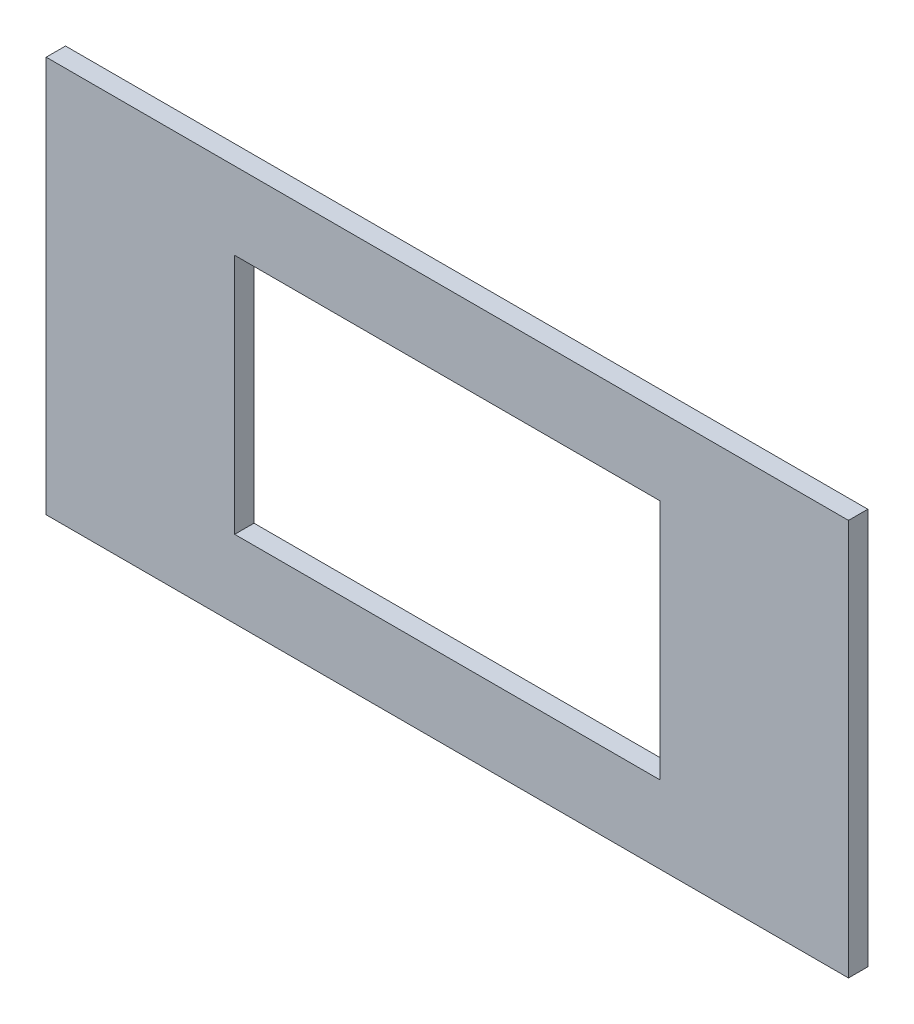
ISO-10303-21;
HEADER;
FILE_DESCRIPTION(('STEP AP214'),'2;1');
FILE_NAME('part.step','',(''),(''),'','','');
FILE_SCHEMA(('AUTOMOTIVE_DESIGN { 1 0 10303 214 1 1 1 1 }'));
ENDSEC;
DATA;
#1=APPLICATION_CONTEXT('core data for automotive mechanical design processes');
#2=APPLICATION_PROTOCOL_DEFINITION('international standard','automotive_design',2000,#1);
#3=PRODUCT_CONTEXT('',#1,'mechanical');
#4=PRODUCT('Part','Part','',(#3));
#5=PRODUCT_RELATED_PRODUCT_CATEGORY('part','',(#4));
#6=PRODUCT_DEFINITION_FORMATION('','',#4);
#7=PRODUCT_DEFINITION_CONTEXT('part definition',#1,'design');
#8=PRODUCT_DEFINITION('design','',#6,#7);
#9=PRODUCT_DEFINITION_SHAPE('','',#8);
#10=(LENGTH_UNIT() NAMED_UNIT(*) SI_UNIT(.MILLI.,.METRE.));
#11=(NAMED_UNIT(*) PLANE_ANGLE_UNIT() SI_UNIT($,.RADIAN.));
#12=(NAMED_UNIT(*) SI_UNIT($,.STERADIAN.) SOLID_ANGLE_UNIT());
#13=UNCERTAINTY_MEASURE_WITH_UNIT(LENGTH_MEASURE(1.E-05),#10,'distance_accuracy_value','');
#14=(GEOMETRIC_REPRESENTATION_CONTEXT(3) GLOBAL_UNCERTAINTY_ASSIGNED_CONTEXT((#13)) GLOBAL_UNIT_ASSIGNED_CONTEXT((#10,
#11,#12)) REPRESENTATION_CONTEXT('',''));
#15=CARTESIAN_POINT('',(0.,0.,0.));
#16=DIRECTION('',(0.,0.,1.));
#17=DIRECTION('',(1.,0.,0.));
#18=AXIS2_PLACEMENT_3D('',#15,#16,#17);
#19=CARTESIAN_POINT('',(0.,0.,0.));
#20=DIRECTION('',(0.,0.,1.));
#21=DIRECTION('',(1.,0.,0.));
#22=AXIS2_PLACEMENT_3D('',#19,#20,#21);
#23=PLANE('',#22);
#24=DIRECTION('',(1.,0.,0.));
#25=VECTOR('',#24,1.);
#26=CARTESIAN_POINT('',(-2.2,1.25,0.));
#27=LINE('',#26,#25);
#28=CARTESIAN_POINT('',(2.2,1.25,0.));
#29=VERTEX_POINT('',#28);
#30=CARTESIAN_POINT('',(-2.2,1.25,0.));
#31=VERTEX_POINT('',#30);
#32=EDGE_CURVE('E123',#29,#31,#27,.F.);
#33=ORIENTED_EDGE('',*,*,#32,.T.);
#34=DIRECTION('',(0.,1.,0.));
#35=VECTOR('',#34,1.);
#36=CARTESIAN_POINT('',(-2.2,-1.25,0.));
#37=LINE('',#36,#35);
#38=CARTESIAN_POINT('',(-2.2,-1.25,0.));
#39=VERTEX_POINT('',#38);
#40=EDGE_CURVE('E116',#31,#39,#37,.F.);
#41=ORIENTED_EDGE('',*,*,#40,.T.);
#42=DIRECTION('',(1.,0.,0.));
#43=VECTOR('',#42,1.);
#44=CARTESIAN_POINT('',(2.2,-1.25,0.));
#45=LINE('',#44,#43);
#46=CARTESIAN_POINT('',(2.2,-1.25,0.));
#47=VERTEX_POINT('',#46);
#48=EDGE_CURVE('E112',#39,#47,#45,.T.);
#49=ORIENTED_EDGE('',*,*,#48,.T.);
#50=DIRECTION('',(0.,1.,0.));
#51=VECTOR('',#50,1.);
#52=CARTESIAN_POINT('',(2.2,1.25,0.));
#53=LINE('',#52,#51);
#54=EDGE_CURVE('E110',#47,#29,#53,.T.);
#55=ORIENTED_EDGE('',*,*,#54,.T.);
#56=EDGE_LOOP('',(#33,#41,#49,#55));
#57=FACE_BOUND('',#56,.T.);
#58=DIRECTION('',(0.,1.,0.));
#59=VECTOR('',#58,1.);
#60=CARTESIAN_POINT('',(4.15,2.05,0.));
#61=LINE('',#60,#59);
#62=CARTESIAN_POINT('',(4.15,-2.05,0.));
#63=VERTEX_POINT('',#62);
#64=CARTESIAN_POINT('',(4.15,2.05,0.));
#65=VERTEX_POINT('',#64);
#66=EDGE_CURVE('E20',#63,#65,#61,.T.);
#67=ORIENTED_EDGE('',*,*,#66,.F.);
#68=DIRECTION('',(1.,0.,0.));
#69=VECTOR('',#68,1.);
#70=CARTESIAN_POINT('',(4.15,-2.05,0.));
#71=LINE('',#70,#69);
#72=CARTESIAN_POINT('',(-4.15,-2.05,0.));
#73=VERTEX_POINT('',#72);
#74=EDGE_CURVE('E107',#73,#63,#71,.T.);
#75=ORIENTED_EDGE('',*,*,#74,.F.);
#76=DIRECTION('',(0.,1.,0.));
#77=VECTOR('',#76,1.);
#78=CARTESIAN_POINT('',(-4.15,-2.05,0.));
#79=LINE('',#78,#77);
#80=CARTESIAN_POINT('',(-4.15,2.05,0.));
#81=VERTEX_POINT('',#80);
#82=EDGE_CURVE('E93',#81,#73,#79,.F.);
#83=ORIENTED_EDGE('',*,*,#82,.F.);
#84=DIRECTION('',(1.,0.,0.));
#85=VECTOR('',#84,1.);
#86=CARTESIAN_POINT('',(-4.15,2.05,0.));
#87=LINE('',#86,#85);
#88=EDGE_CURVE('E80',#65,#81,#87,.F.);
#89=ORIENTED_EDGE('',*,*,#88,.F.);
#90=EDGE_LOOP('',(#67,#75,#83,#89));
#91=FACE_BOUND('',#90,.T.);
#92=ADVANCED_FACE('F17',(#57,#91),#23,.F.);
#93=CARTESIAN_POINT('',(4.15,2.05,0.));
#94=DIRECTION('',(1.,0.,0.));
#95=DIRECTION('',(0.,0.,-1.));
#96=AXIS2_PLACEMENT_3D('',#93,#94,#95);
#97=PLANE('',#96);
#98=ORIENTED_EDGE('',*,*,#66,.T.);
#99=DIRECTION('',(0.,0.,1.));
#100=VECTOR('',#99,1.);
#101=CARTESIAN_POINT('',(4.15,2.05,0.));
#102=LINE('',#101,#100);
#103=CARTESIAN_POINT('',(4.15,2.05,0.2));
#104=VERTEX_POINT('',#103);
#105=EDGE_CURVE('E86',#104,#65,#102,.F.);
#106=ORIENTED_EDGE('',*,*,#105,.F.);
#107=DIRECTION('',(0.,1.,0.));
#108=VECTOR('',#107,1.);
#109=CARTESIAN_POINT('',(4.15,0.,0.2));
#110=LINE('',#109,#108);
#111=CARTESIAN_POINT('',(4.15,-2.05,0.2));
#112=VERTEX_POINT('',#111);
#113=EDGE_CURVE('E126',#112,#104,#110,.T.);
#114=ORIENTED_EDGE('',*,*,#113,.F.);
#115=DIRECTION('',(0.,0.,-1.));
#116=VECTOR('',#115,1.);
#117=CARTESIAN_POINT('',(4.15,-2.05,0.));
#118=LINE('',#117,#116);
#119=EDGE_CURVE('E89',#63,#112,#118,.F.);
#120=ORIENTED_EDGE('',*,*,#119,.F.);
#121=EDGE_LOOP('',(#98,#106,#114,#120));
#122=FACE_BOUND('',#121,.T.);
#123=ADVANCED_FACE('F85',(#122),#97,.T.);
#124=CARTESIAN_POINT('',(-4.15,2.05,0.));
#125=DIRECTION('',(0.,1.,0.));
#126=DIRECTION('',(0.,0.,1.));
#127=AXIS2_PLACEMENT_3D('',#124,#125,#126);
#128=PLANE('',#127);
#129=ORIENTED_EDGE('',*,*,#88,.T.);
#130=DIRECTION('',(0.,0.,1.));
#131=VECTOR('',#130,1.);
#132=CARTESIAN_POINT('',(-4.15,2.05,0.));
#133=LINE('',#132,#131);
#134=CARTESIAN_POINT('',(-4.15,2.05,0.2));
#135=VERTEX_POINT('',#134);
#136=EDGE_CURVE('E95',#135,#81,#133,.F.);
#137=ORIENTED_EDGE('',*,*,#136,.F.);
#138=DIRECTION('',(1.,0.,0.));
#139=VECTOR('',#138,1.);
#140=CARTESIAN_POINT('',(0.,2.05,0.2));
#141=LINE('',#140,#139);
#142=EDGE_CURVE('E99',#104,#135,#141,.F.);
#143=ORIENTED_EDGE('',*,*,#142,.F.);
#144=ORIENTED_EDGE('',*,*,#105,.T.);
#145=EDGE_LOOP('',(#129,#137,#143,#144));
#146=FACE_BOUND('',#145,.T.);
#147=ADVANCED_FACE('F97',(#146),#128,.T.);
#148=CARTESIAN_POINT('',(-4.15,-2.05,0.));
#149=DIRECTION('',(-1.,0.,0.));
#150=DIRECTION('',(0.,0.,1.));
#151=AXIS2_PLACEMENT_3D('',#148,#149,#150);
#152=PLANE('',#151);
#153=ORIENTED_EDGE('',*,*,#82,.T.);
#154=DIRECTION('',(0.,0.,-1.));
#155=VECTOR('',#154,1.);
#156=CARTESIAN_POINT('',(-4.15,-2.05,0.));
#157=LINE('',#156,#155);
#158=CARTESIAN_POINT('',(-4.15,-2.05,0.2));
#159=VERTEX_POINT('',#158);
#160=EDGE_CURVE('E104',#159,#73,#157,.T.);
#161=ORIENTED_EDGE('',*,*,#160,.F.);
#162=DIRECTION('',(0.,1.,0.));
#163=VECTOR('',#162,1.);
#164=CARTESIAN_POINT('',(-4.15,0.,0.2));
#165=LINE('',#164,#163);
#166=EDGE_CURVE('E129',#135,#159,#165,.F.);
#167=ORIENTED_EDGE('',*,*,#166,.F.);
#168=ORIENTED_EDGE('',*,*,#136,.T.);
#169=EDGE_LOOP('',(#153,#161,#167,#168));
#170=FACE_BOUND('',#169,.T.);
#171=ADVANCED_FACE('F177',(#170),#152,.T.);
#172=CARTESIAN_POINT('',(4.15,-2.05,0.));
#173=DIRECTION('',(0.,-1.,0.));
#174=DIRECTION('',(0.,0.,-1.));
#175=AXIS2_PLACEMENT_3D('',#172,#173,#174);
#176=PLANE('',#175);
#177=ORIENTED_EDGE('',*,*,#74,.T.);
#178=ORIENTED_EDGE('',*,*,#119,.T.);
#179=DIRECTION('',(1.,0.,0.));
#180=VECTOR('',#179,1.);
#181=CARTESIAN_POINT('',(0.,-2.05,0.2));
#182=LINE('',#181,#180);
#183=EDGE_CURVE('E132',#159,#112,#182,.T.);
#184=ORIENTED_EDGE('',*,*,#183,.F.);
#185=ORIENTED_EDGE('',*,*,#160,.T.);
#186=EDGE_LOOP('',(#177,#178,#184,#185));
#187=FACE_BOUND('',#186,.T.);
#188=ADVANCED_FACE('F174',(#187),#176,.T.);
#189=CARTESIAN_POINT('',(2.2,1.25,0.));
#190=DIRECTION('',(1.,0.,0.));
#191=DIRECTION('',(0.,0.,-1.));
#192=AXIS2_PLACEMENT_3D('',#189,#190,#191);
#193=PLANE('',#192);
#194=DIRECTION('',(0.,0.,1.));
#195=VECTOR('',#194,1.);
#196=CARTESIAN_POINT('',(2.2,1.25,0.));
#197=LINE('',#196,#195);
#198=CARTESIAN_POINT('',(2.2,1.25,0.2));
#199=VERTEX_POINT('',#198);
#200=EDGE_CURVE('E120',#199,#29,#197,.F.);
#201=ORIENTED_EDGE('',*,*,#200,.T.);
#202=ORIENTED_EDGE('',*,*,#54,.F.);
#203=DIRECTION('',(0.,0.,-1.));
#204=VECTOR('',#203,1.);
#205=CARTESIAN_POINT('',(2.2,-1.25,0.));
#206=LINE('',#205,#204);
#207=CARTESIAN_POINT('',(2.2,-1.25,0.2));
#208=VERTEX_POINT('',#207);
#209=EDGE_CURVE('E114',#47,#208,#206,.F.);
#210=ORIENTED_EDGE('',*,*,#209,.T.);
#211=DIRECTION('',(0.,1.,0.));
#212=VECTOR('',#211,1.);
#213=CARTESIAN_POINT('',(2.2,0.,0.2));
#214=LINE('',#213,#212);
#215=EDGE_CURVE('E135',#199,#208,#214,.F.);
#216=ORIENTED_EDGE('',*,*,#215,.F.);
#217=EDGE_LOOP('',(#201,#202,#210,#216));
#218=FACE_BOUND('',#217,.T.);
#219=ADVANCED_FACE('F155',(#218),#193,.F.);
#220=CARTESIAN_POINT('',(2.2,-1.25,0.));
#221=DIRECTION('',(0.,-1.,0.));
#222=DIRECTION('',(0.,0.,-1.));
#223=AXIS2_PLACEMENT_3D('',#220,#221,#222);
#224=PLANE('',#223);
#225=ORIENTED_EDGE('',*,*,#209,.F.);
#226=ORIENTED_EDGE('',*,*,#48,.F.);
#227=DIRECTION('',(0.,0.,1.));
#228=VECTOR('',#227,1.);
#229=CARTESIAN_POINT('',(-2.2,-1.25,0.));
#230=LINE('',#229,#228);
#231=CARTESIAN_POINT('',(-2.2,-1.25,0.2));
#232=VERTEX_POINT('',#231);
#233=EDGE_CURVE('E118',#39,#232,#230,.T.);
#234=ORIENTED_EDGE('',*,*,#233,.T.);
#235=DIRECTION('',(1.,0.,0.));
#236=VECTOR('',#235,1.);
#237=CARTESIAN_POINT('',(0.,-1.25,0.2));
#238=LINE('',#237,#236);
#239=EDGE_CURVE('E138',#208,#232,#238,.F.);
#240=ORIENTED_EDGE('',*,*,#239,.F.);
#241=EDGE_LOOP('',(#225,#226,#234,#240));
#242=FACE_BOUND('',#241,.T.);
#243=ADVANCED_FACE('F151',(#242),#224,.F.);
#244=CARTESIAN_POINT('',(-2.2,-1.25,0.));
#245=DIRECTION('',(-1.,0.,0.));
#246=DIRECTION('',(0.,0.,1.));
#247=AXIS2_PLACEMENT_3D('',#244,#245,#246);
#248=PLANE('',#247);
#249=ORIENTED_EDGE('',*,*,#233,.F.);
#250=ORIENTED_EDGE('',*,*,#40,.F.);
#251=DIRECTION('',(0.,0.,1.));
#252=VECTOR('',#251,1.);
#253=CARTESIAN_POINT('',(-2.2,1.25,0.));
#254=LINE('',#253,#252);
#255=CARTESIAN_POINT('',(-2.2,1.25,0.2));
#256=VERTEX_POINT('',#255);
#257=EDGE_CURVE('E35',#31,#256,#254,.T.);
#258=ORIENTED_EDGE('',*,*,#257,.T.);
#259=DIRECTION('',(0.,1.,0.));
#260=VECTOR('',#259,1.);
#261=CARTESIAN_POINT('',(-2.2,0.,0.2));
#262=LINE('',#261,#260);
#263=EDGE_CURVE('E26',#232,#256,#262,.T.);
#264=ORIENTED_EDGE('',*,*,#263,.F.);
#265=EDGE_LOOP('',(#249,#250,#258,#264));
#266=FACE_BOUND('',#265,.T.);
#267=ADVANCED_FACE('F147',(#266),#248,.F.);
#268=CARTESIAN_POINT('',(-2.2,1.25,0.));
#269=DIRECTION('',(0.,1.,0.));
#270=DIRECTION('',(0.,0.,1.));
#271=AXIS2_PLACEMENT_3D('',#268,#269,#270);
#272=PLANE('',#271);
#273=ORIENTED_EDGE('',*,*,#257,.F.);
#274=ORIENTED_EDGE('',*,*,#32,.F.);
#275=ORIENTED_EDGE('',*,*,#200,.F.);
#276=DIRECTION('',(1.,0.,0.));
#277=VECTOR('',#276,1.);
#278=CARTESIAN_POINT('',(0.,1.25,0.2));
#279=LINE('',#278,#277);
#280=EDGE_CURVE('E11',#256,#199,#279,.T.);
#281=ORIENTED_EDGE('',*,*,#280,.F.);
#282=EDGE_LOOP('',(#273,#274,#275,#281));
#283=FACE_BOUND('',#282,.T.);
#284=ADVANCED_FACE('F159',(#283),#272,.F.);
#285=CARTESIAN_POINT('',(0.,0.,0.2));
#286=DIRECTION('',(0.,0.,1.));
#287=DIRECTION('',(1.,0.,0.));
#288=AXIS2_PLACEMENT_3D('',#285,#286,#287);
#289=PLANE('',#288);
#290=ORIENTED_EDGE('',*,*,#263,.T.);
#291=ORIENTED_EDGE('',*,*,#280,.T.);
#292=ORIENTED_EDGE('',*,*,#215,.T.);
#293=ORIENTED_EDGE('',*,*,#239,.T.);
#294=EDGE_LOOP('',(#290,#291,#292,#293));
#295=FACE_BOUND('',#294,.T.);
#296=ORIENTED_EDGE('',*,*,#166,.T.);
#297=ORIENTED_EDGE('',*,*,#183,.T.);
#298=ORIENTED_EDGE('',*,*,#113,.T.);
#299=ORIENTED_EDGE('',*,*,#142,.T.);
#300=EDGE_LOOP('',(#296,#297,#298,#299));
#301=FACE_BOUND('',#300,.T.);
#302=ADVANCED_FACE('F143',(#295,#301),#289,.T.);
#303=CLOSED_SHELL('',(#92,#123,#147,#171,#188,#219,#243,#267,#284,#302));
#304=MANIFOLD_SOLID_BREP('B1',#303);
#305=ADVANCED_BREP_SHAPE_REPRESENTATION('',(#18,#304),#14);
#306=SHAPE_DEFINITION_REPRESENTATION(#9,#305);
ENDSEC;
END-ISO-10303-21;
